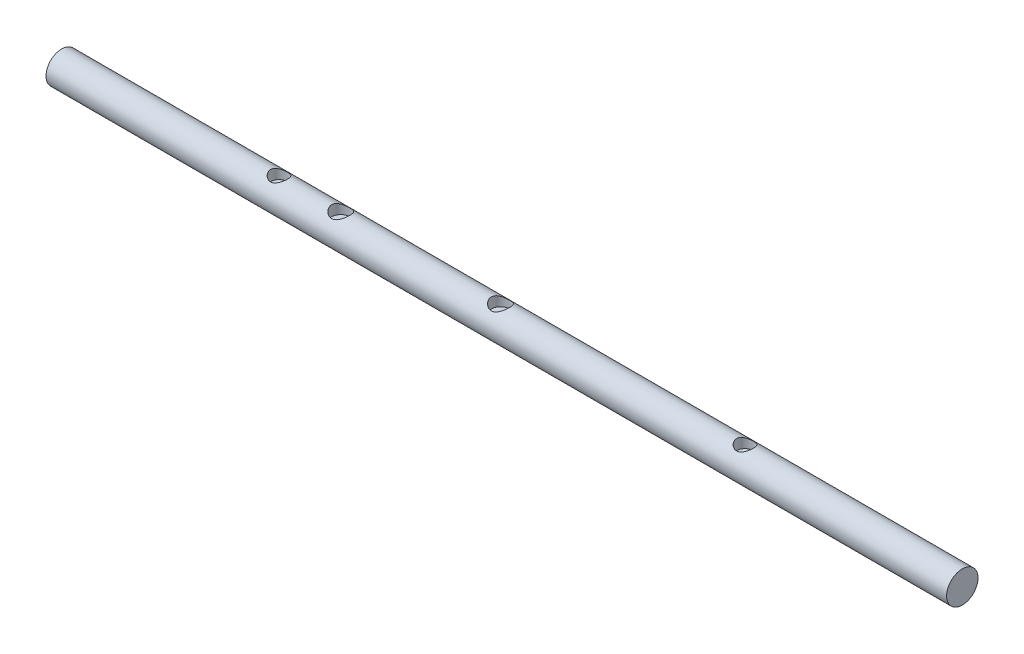
ISO-10303-21;
HEADER;
FILE_DESCRIPTION(('STEP AP214'),'2;1');
FILE_NAME('part.step','',(''),(''),'','','');
FILE_SCHEMA(('AUTOMOTIVE_DESIGN { 1 0 10303 214 1 1 1 1 }'));
ENDSEC;
DATA;
#1=APPLICATION_CONTEXT('core data for automotive mechanical design processes');
#2=APPLICATION_PROTOCOL_DEFINITION('international standard','automotive_design',2000,#1);
#3=PRODUCT_CONTEXT('',#1,'mechanical');
#4=PRODUCT('Part','Part','',(#3));
#5=PRODUCT_RELATED_PRODUCT_CATEGORY('part','',(#4));
#6=PRODUCT_DEFINITION_FORMATION('','',#4);
#7=PRODUCT_DEFINITION_CONTEXT('part definition',#1,'design');
#8=PRODUCT_DEFINITION('design','',#6,#7);
#9=PRODUCT_DEFINITION_SHAPE('','',#8);
#10=(LENGTH_UNIT() NAMED_UNIT(*) SI_UNIT(.MILLI.,.METRE.));
#11=(NAMED_UNIT(*) PLANE_ANGLE_UNIT() SI_UNIT($,.RADIAN.));
#12=(NAMED_UNIT(*) SI_UNIT($,.STERADIAN.) SOLID_ANGLE_UNIT());
#13=UNCERTAINTY_MEASURE_WITH_UNIT(LENGTH_MEASURE(1.E-05),#10,'distance_accuracy_value','');
#14=(GEOMETRIC_REPRESENTATION_CONTEXT(3) GLOBAL_UNCERTAINTY_ASSIGNED_CONTEXT((#13)) GLOBAL_UNIT_ASSIGNED_CONTEXT((#10,
#11,#12)) REPRESENTATION_CONTEXT('',''));
#15=CARTESIAN_POINT('',(0.,0.,0.));
#16=DIRECTION('',(0.,0.,1.));
#17=DIRECTION('',(1.,0.,0.));
#18=AXIS2_PLACEMENT_3D('',#15,#16,#17);
#19=CARTESIAN_POINT('',(-158.807280426727,1.90243902439024,0.));
#20=DIRECTION('',(-1.,0.,0.));
#21=DIRECTION('',(0.,0.,1.));
#22=AXIS2_PLACEMENT_3D('',#19,#20,#21);
#23=PLANE('',#22);
#24=CARTESIAN_POINT('',(-158.807280426727,1.90243902439024,0.));
#25=DIRECTION('',(-1.,0.,0.));
#26=DIRECTION('',(0.,0.,1.));
#27=AXIS2_PLACEMENT_3D('',#24,#25,#26);
#28=CIRCLE('',#27,3.);
#29=CARTESIAN_POINT('',(-158.807280426727,1.90243902439024,3.));
#30=VERTEX_POINT('',#29);
#31=EDGE_CURVE('E86',#30,#30,#28,.T.);
#32=ORIENTED_EDGE('',*,*,#31,.T.);
#33=EDGE_LOOP('',(#32));
#34=FACE_BOUND('',#33,.T.);
#35=ADVANCED_FACE('F30',(#34),#23,.T.);
#36=CARTESIAN_POINT('',(-158.807280426727,1.90243902439024,0.));
#37=DIRECTION('',(-1.,0.,0.));
#38=DIRECTION('',(0.,0.,1.));
#39=AXIS2_PLACEMENT_3D('',#36,#37,#38);
#40=CYLINDRICAL_SURFACE('',#39,3.);
#41=CARTESIAN_POINT('',(-105.507280426727,4.33913761059249,1.75));
#42=CARTESIAN_POINT('',(-105.418641531446,4.33913723530836,1.75000045184634));
#43=CARTESIAN_POINT('',(-105.330004321061,4.34404690899767,1.74322391194511));
#44=CARTESIAN_POINT('',(-105.155671235548,4.36284293080755,1.71658538535328));
#45=CARTESIAN_POINT('',(-105.069978488247,4.37673853179508,1.69670991020086));
#46=CARTESIAN_POINT('',(-104.904409163897,4.41130721542861,1.64515183199159));
#47=CARTESIAN_POINT('',(-104.824497468406,4.43193426987562,1.61354922075016));
#48=CARTESIAN_POINT('',(-104.671150372913,4.47755901924247,1.53968773008133));
#49=CARTESIAN_POINT('',(-104.597717056532,4.50255811267368,1.49742543895691));
#50=CARTESIAN_POINT('',(-104.450151281322,4.55758614424946,1.39777992638195));
#51=CARTESIAN_POINT('',(-104.376907376253,4.58786299897202,1.33921745197901));
#52=CARTESIAN_POINT('',(-104.240551260762,4.6480461718147,1.21105723337492));
#53=CARTESIAN_POINT('',(-104.177446060368,4.67795222048281,1.14145191954028));
#54=CARTESIAN_POINT('',(-104.056915186871,4.73758395133871,0.984713035802144));
#55=CARTESIAN_POINT('',(-104.000691674238,4.76699147363729,0.896522073845247));
#56=CARTESIAN_POINT('',(-103.904297675824,4.81884107580118,0.709891668525838));
#57=CARTESIAN_POINT('',(-103.864113326747,4.84128916721883,0.611461168794444));
#58=CARTESIAN_POINT('',(-103.804840852669,4.8748559224903,0.416649273147372));
#59=CARTESIAN_POINT('',(-103.784161105008,4.88682210638916,0.320901861024324));
#60=CARTESIAN_POINT('',(-103.759128724244,4.90134287656261,0.126621897572967));
#61=CARTESIAN_POINT('',(-103.754761826026,4.9039056857815,0.0280918555915908));
#62=CARTESIAN_POINT('',(-103.762136805078,4.89960876840552,-0.156495068538422));
#63=CARTESIAN_POINT('',(-103.772047715387,4.89381991594171,-0.242658294595014));
#64=CARTESIAN_POINT('',(-103.804253976583,4.87525347351467,-0.411844523266137));
#65=CARTESIAN_POINT('',(-103.826550241395,4.86247536780944,-0.494867293660781));
#66=CARTESIAN_POINT('',(-103.88276251452,4.83092244262679,-0.656364893028942));
#67=CARTESIAN_POINT('',(-103.916766421572,4.8121023353425,-0.734799910253173));
#68=CARTESIAN_POINT('',(-103.995158036549,4.77000278211207,-0.884967789919838));
#69=CARTESIAN_POINT('',(-104.039548657745,4.74672208538971,-0.956698764094662));
#70=CARTESIAN_POINT('',(-104.143269177095,4.69453276609062,-1.10031993041439));
#71=CARTESIAN_POINT('',(-104.203733756588,4.66528461671352,-1.17126676062861));
#72=CARTESIAN_POINT('',(-104.334945977294,4.6058524212521,-1.30259918374289));
#73=CARTESIAN_POINT('',(-104.405706712092,4.57566722256191,-1.3629711098475));
#74=CARTESIAN_POINT('',(-104.564457173089,4.51404786463935,-1.47789838153368));
#75=CARTESIAN_POINT('',(-104.653478797751,4.48282209775406,-1.53115297544719));
#76=CARTESIAN_POINT('',(-104.84118890961,4.42696289837199,-1.62161168095688));
#77=CARTESIAN_POINT('',(-104.939859509191,4.40231757187426,-1.65884482652416));
#78=CARTESIAN_POINT('',(-105.120046417644,4.36852484856211,-1.7085372011066));
#79=CARTESIAN_POINT('',(-105.200092002106,4.35708951233583,-1.72477506877111));
#80=CARTESIAN_POINT('',(-105.362362901543,4.3421117518518,-1.74590213357921));
#81=CARTESIAN_POINT('',(-105.444585859386,4.33856111914416,-1.75080313330495));
#82=CARTESIAN_POINT('',(-105.608901630009,4.33986956308162,-1.74898039241038));
#83=CARTESIAN_POINT('',(-105.690994260813,4.34473615815191,-1.74224625907734));
#84=CARTESIAN_POINT('',(-105.852642567158,4.36217426084861,-1.71753388251395));
#85=CARTESIAN_POINT('',(-105.932196277537,4.37475159148775,-1.69954714130061));
#86=CARTESIAN_POINT('',(-106.087467424403,4.40609181115408,-1.65302928692431));
#87=CARTESIAN_POINT('',(-106.163152919132,4.42489882088418,-1.62442278126807));
#88=CARTESIAN_POINT('',(-106.30892937046,4.46666466493333,-1.55765692699782));
#89=CARTESIAN_POINT('',(-106.379018101748,4.48962513896661,-1.51949380330519));
#90=CARTESIAN_POINT('',(-106.524399283031,4.54188291937461,-1.42709875316828));
#91=CARTESIAN_POINT('',(-106.598506816652,4.57159036344945,-1.37123101284258));
#92=CARTESIAN_POINT('',(-106.737021942423,4.63114763415145,-1.24852240970034));
#93=CARTESIAN_POINT('',(-106.801420853425,4.66099756387218,-1.18167183667127));
#94=CARTESIAN_POINT('',(-106.925904132265,4.72142973988237,-1.02989256043404));
#95=CARTESIAN_POINT('',(-106.984700112567,4.75172041345184,-0.943778122538591));
#96=CARTESIAN_POINT('',(-107.086662226916,4.80589918405285,-0.760910913608859));
#97=CARTESIAN_POINT('',(-107.129840061324,4.82979207049812,-0.664166177419411));
#98=CARTESIAN_POINT('',(-107.195643319311,4.86679224526954,-0.47067402489659));
#99=CARTESIAN_POINT('',(-107.219615880414,4.88059889039796,-0.374522814239406));
#100=CARTESIAN_POINT('',(-107.250945166461,4.89871949654074,-0.178706533702763));
#101=CARTESIAN_POINT('',(-107.258318202898,4.90304277625949,-0.0790450111451294));
#102=CARTESIAN_POINT('',(-107.256146609079,4.90177905155775,0.107655929988305));
#103=CARTESIAN_POINT('',(-107.24857832381,4.89734971619842,0.194734538061884));
#104=CARTESIAN_POINT('',(-107.220750573413,4.88125599933134,0.366137785941607));
#105=CARTESIAN_POINT('',(-107.200490632246,4.86959134644201,0.450462322323413));
#106=CARTESIAN_POINT('',(-107.148350893452,4.84015143934269,0.613761582363572));
#107=CARTESIAN_POINT('',(-107.116532520951,4.82240851484728,0.69276201643977));
#108=CARTESIAN_POINT('',(-107.042424828591,4.78223067777332,0.844368647802306));
#109=CARTESIAN_POINT('',(-107.000132883332,4.75979458898304,0.916973235651941));
#110=CARTESIAN_POINT('',(-106.901045560607,4.70922864147308,1.06230015031832));
#111=CARTESIAN_POINT('',(-106.843167477503,4.68074408218634,1.13415977100245));
#112=CARTESIAN_POINT('',(-106.717166437013,4.62240282910893,1.26772272997665));
#113=CARTESIAN_POINT('',(-106.649031421269,4.5925445494081,1.32941393272294));
#114=CARTESIAN_POINT('',(-106.495269536322,4.53076684457972,1.44805208639207));
#115=CARTESIAN_POINT('',(-106.408533785546,4.49900120197476,1.50365362198231));
#116=CARTESIAN_POINT('',(-106.225145452224,4.44120003340224,1.59932168084082));
#117=CARTESIAN_POINT('',(-106.128505241804,4.4151574833474,1.63940729371889));
#118=CARTESIAN_POINT('',(-105.944900822951,4.37678998306395,1.69663483894556));
#119=CARTESIAN_POINT('',(-105.859138371527,4.36287463392268,1.71653991344376));
#120=CARTESIAN_POINT('',(-105.684674094747,4.34405473809928,1.74321337060432));
#121=CARTESIAN_POINT('',(-105.595976417204,4.33913798611835,1.74999954786261));
#122=CARTESIAN_POINT('',(-105.507280426727,4.33913761059249,1.75));
#123=B_SPLINE_CURVE_WITH_KNOTS('',3,(#41,#42,#43,#44,#45,#46,#47,#48,#49,#50,#51,#52,#53,#54,
#55,#56,#57,#58,#59,#60,#61,#62,#63,#64,#65,#66,#67,#68,#69,#70,#71,#72,#73,#74,#75,#76,#77,#78,
#79,#80,#81,#82,#83,#84,#85,#86,#87,#88,#89,#90,#91,#92,#93,#94,#95,#96,#97,#98,#99,#100,#101,
#102,#103,#104,#105,#106,#107,#108,#109,#110,#111,#112,#113,#114,#115,#116,#117,#118,#119,#120,
#121,#122),.UNSPECIFIED.,.T.,.F.,(4,2,2,2,2,2,2,2,2,2,2,2,2,2,2,2,2,2,2,2,2,2,2,2,2,2,2,2,2,2,2,
2,2,2,2,2,2,2,2,2,4),(0.,0.2655452187637,0.53136430747416,0.795402587763056,1.05952548262139,
1.35398659107802,1.64865042554403,1.972831424877,2.29673161156481,2.59104789961809,
2.88510675625998,3.14464340280144,3.40419920332161,3.66574779852172,3.92736984114419,
4.21928633023892,4.51157734664538,4.83494305243832,5.15772026336275,5.40406403188871,
5.65015122128838,5.89645833389884,6.14295168285399,6.39122950133274,6.63960555026166,
6.93078691809868,7.22222712635784,7.54626723053989,7.87006407425507,8.16844648867913,
8.46653556995419,8.72782114336878,8.98911651764956,9.24904312841218,9.50903496080324,
9.79757898950312,10.0864649272872,10.4083273312523,10.7297924718895,10.9958699008298,
11.2615861659037),.UNSPECIFIED.);
#124=CARTESIAN_POINT('',(-105.507280426727,4.33913761059249,1.75));
#125=VERTEX_POINT('',#124);
#126=EDGE_CURVE('E10',#125,#125,#123,.T.);
#127=ORIENTED_EDGE('',*,*,#126,.F.);
#128=EDGE_LOOP('',(#127));
#129=FACE_BOUND('',#128,.T.);
#130=CARTESIAN_POINT('',(-75.0072804267274,4.33913761059249,1.75));
#131=CARTESIAN_POINT('',(-74.918641531446,4.33913723530836,1.75000045184634));
#132=CARTESIAN_POINT('',(-74.8300043210609,4.34404690899767,1.74322391194511));
#133=CARTESIAN_POINT('',(-74.6556712355481,4.36284293080755,1.71658538535328));
#134=CARTESIAN_POINT('',(-74.569978488247,4.37673853179508,1.69670991020086));
#135=CARTESIAN_POINT('',(-74.4044091638969,4.41130721542861,1.64515183199159));
#136=CARTESIAN_POINT('',(-74.3244974684062,4.43193426987562,1.61354922075016));
#137=CARTESIAN_POINT('',(-74.1711503729129,4.47755901924247,1.53968773008133));
#138=CARTESIAN_POINT('',(-74.0977170565318,4.50255811267368,1.49742543895691));
#139=CARTESIAN_POINT('',(-73.9501512813216,4.55758614424946,1.39777992638195));
#140=CARTESIAN_POINT('',(-73.8769073762534,4.58786299897202,1.33921745197901));
#141=CARTESIAN_POINT('',(-73.7405512607623,4.6480461718147,1.21105723337492));
#142=CARTESIAN_POINT('',(-73.6774460603676,4.67795222048281,1.14145191954028));
#143=CARTESIAN_POINT('',(-73.5569151868713,4.73758395133871,0.984713035802144));
#144=CARTESIAN_POINT('',(-73.5006916742382,4.76699147363729,0.896522073845247));
#145=CARTESIAN_POINT('',(-73.4042976758237,4.81884107580118,0.709891668525838));
#146=CARTESIAN_POINT('',(-73.3641133267474,4.84128916721883,0.611461168794444));
#147=CARTESIAN_POINT('',(-73.3048408526686,4.8748559224903,0.416649273147372));
#148=CARTESIAN_POINT('',(-73.2841611050082,4.88682210638916,0.320901861024323));
#149=CARTESIAN_POINT('',(-73.2591287242444,4.90134287656261,0.126621897572966));
#150=CARTESIAN_POINT('',(-73.254761826026,4.9039056857815,0.0280918555915903));
#151=CARTESIAN_POINT('',(-73.2621368050776,4.89960876840552,-0.156495068538422));
#152=CARTESIAN_POINT('',(-73.2720477153867,4.89381991594171,-0.242658294595014));
#153=CARTESIAN_POINT('',(-73.3042539765826,4.87525347351467,-0.411844523266137));
#154=CARTESIAN_POINT('',(-73.3265502413954,4.86247536780944,-0.494867293660781));
#155=CARTESIAN_POINT('',(-73.3827625145198,4.83092244262679,-0.656364893028942));
#156=CARTESIAN_POINT('',(-73.4167664215715,4.8121023353425,-0.734799910253173));
#157=CARTESIAN_POINT('',(-73.4951580365486,4.77000278211207,-0.884967789919838));
#158=CARTESIAN_POINT('',(-73.5395486577454,4.74672208538971,-0.956698764094662));
#159=CARTESIAN_POINT('',(-73.6432691770949,4.69453276609062,-1.10031993041439));
#160=CARTESIAN_POINT('',(-73.7037337565881,4.66528461671352,-1.17126676062861));
#161=CARTESIAN_POINT('',(-73.8349459772945,4.6058524212521,-1.30259918374289));
#162=CARTESIAN_POINT('',(-73.9057067120921,4.57566722256191,-1.3629711098475));
#163=CARTESIAN_POINT('',(-74.0644571730887,4.51404786463935,-1.47789838153368));
#164=CARTESIAN_POINT('',(-74.153478797751,4.48282209775406,-1.53115297544719));
#165=CARTESIAN_POINT('',(-74.3411889096099,4.42696289837199,-1.62161168095688));
#166=CARTESIAN_POINT('',(-74.4398595091906,4.40231757187426,-1.65884482652416));
#167=CARTESIAN_POINT('',(-74.6200464176443,4.36852484856211,-1.7085372011066));
#168=CARTESIAN_POINT('',(-74.7000920021063,4.35708951233583,-1.72477506877111));
#169=CARTESIAN_POINT('',(-74.8623629015428,4.3421117518518,-1.74590213357921));
#170=CARTESIAN_POINT('',(-74.9445858593855,4.33856111914416,-1.75080313330495));
#171=CARTESIAN_POINT('',(-75.108901630009,4.33986956308162,-1.74898039241038));
#172=CARTESIAN_POINT('',(-75.1909942608133,4.34473615815191,-1.74224625907734));
#173=CARTESIAN_POINT('',(-75.3526425671579,4.36217426084861,-1.71753388251395));
#174=CARTESIAN_POINT('',(-75.4321962775368,4.37475159148775,-1.69954714130061));
#175=CARTESIAN_POINT('',(-75.5874674244025,4.40609181115408,-1.65302928692431));
#176=CARTESIAN_POINT('',(-75.6631529191318,4.42489882088418,-1.62442278126807));
#177=CARTESIAN_POINT('',(-75.8089293704604,4.46666466493333,-1.55765692699782));
#178=CARTESIAN_POINT('',(-75.8790181017482,4.48962513896661,-1.51949380330519));
#179=CARTESIAN_POINT('',(-76.0243992830305,4.54188291937461,-1.42709875316828));
#180=CARTESIAN_POINT('',(-76.0985068166523,4.57159036344945,-1.37123101284258));
#181=CARTESIAN_POINT('',(-76.2370219424235,4.63114763415145,-1.24852240970034));
#182=CARTESIAN_POINT('',(-76.3014208534254,4.66099756387218,-1.18167183667127));
#183=CARTESIAN_POINT('',(-76.4259041322653,4.72142973988237,-1.02989256043403));
#184=CARTESIAN_POINT('',(-76.4847001125672,4.75172041345184,-0.943778122538587));
#185=CARTESIAN_POINT('',(-76.5866622269155,4.80589918405285,-0.760910913608855));
#186=CARTESIAN_POINT('',(-76.6298400613238,4.82979207049812,-0.664166177419409));
#187=CARTESIAN_POINT('',(-76.695643319311,4.86679224526954,-0.47067402489659));
#188=CARTESIAN_POINT('',(-76.7196158804139,4.88059889039796,-0.374522814239406));
#189=CARTESIAN_POINT('',(-76.7509451664609,4.89871949654074,-0.178706533702763));
#190=CARTESIAN_POINT('',(-76.7583182028977,4.90304277625949,-0.0790450111451294));
#191=CARTESIAN_POINT('',(-76.7561466090788,4.90177905155775,0.107655929988305));
#192=CARTESIAN_POINT('',(-76.7485783238101,4.89734971619842,0.194734538061884));
#193=CARTESIAN_POINT('',(-76.7207505734127,4.88125599933134,0.366137785941607));
#194=CARTESIAN_POINT('',(-76.7004906322463,4.86959134644201,0.450462322323413));
#195=CARTESIAN_POINT('',(-76.6483508934525,4.84015143934269,0.613761582363572));
#196=CARTESIAN_POINT('',(-76.6165325209513,4.82240851484728,0.69276201643977));
#197=CARTESIAN_POINT('',(-76.5424248285914,4.78223067777332,0.844368647802306));
#198=CARTESIAN_POINT('',(-76.5001328833318,4.75979458898304,0.916973235651941));
#199=CARTESIAN_POINT('',(-76.4010455606065,4.70922864147308,1.06230015031832));
#200=CARTESIAN_POINT('',(-76.3431674775032,4.68074408218634,1.13415977100245));
#201=CARTESIAN_POINT('',(-76.2171664370126,4.62240282910893,1.26772272997665));
#202=CARTESIAN_POINT('',(-76.1490314212692,4.5925445494081,1.32941393272294));
#203=CARTESIAN_POINT('',(-75.9952695363219,4.53076684457972,1.44805208639207));
#204=CARTESIAN_POINT('',(-75.9085337855463,4.49900120197476,1.50365362198231));
#205=CARTESIAN_POINT('',(-75.7251454522238,4.44120003340224,1.59932168084082));
#206=CARTESIAN_POINT('',(-75.6285052418039,4.4151574833474,1.63940729371889));
#207=CARTESIAN_POINT('',(-75.4449008229507,4.37678998306395,1.69663483894556));
#208=CARTESIAN_POINT('',(-75.3591383715268,4.36287463392268,1.71653991344376));
#209=CARTESIAN_POINT('',(-75.1846740947475,4.34405473809928,1.74321337060432));
#210=CARTESIAN_POINT('',(-75.0959764172036,4.33913798611835,1.74999954786261));
#211=CARTESIAN_POINT('',(-75.0072804267274,4.33913761059249,1.75));
#212=B_SPLINE_CURVE_WITH_KNOTS('',3,(#130,#131,#132,#133,#134,#135,#136,#137,#138,#139,#140,
#141,#142,#143,#144,#145,#146,#147,#148,#149,#150,#151,#152,#153,#154,#155,#156,#157,#158,#159,
#160,#161,#162,#163,#164,#165,#166,#167,#168,#169,#170,#171,#172,#173,#174,#175,#176,#177,#178,
#179,#180,#181,#182,#183,#184,#185,#186,#187,#188,#189,#190,#191,#192,#193,#194,#195,#196,#197,
#198,#199,#200,#201,#202,#203,#204,#205,#206,#207,#208,#209,#210,#211),.UNSPECIFIED.,.T.,.F.,(4,
2,2,2,2,2,2,2,2,2,2,2,2,2,2,2,2,2,2,2,2,2,2,2,2,2,2,2,2,2,2,2,2,2,2,2,2,2,2,2,4),(0.,
0.2655452187637,0.53136430747416,0.795402587763056,1.05952548262139,1.35398659107802,
1.64865042554403,1.972831424877,2.29673161156481,2.59104789961809,2.88510675625998,
3.14464340280144,3.40419920332161,3.66574779852172,3.92736984114419,4.21928633023892,
4.51157734664538,4.83494305243832,5.15772026336275,5.40406403188871,5.65015122128838,
5.89645833389884,6.14295168285399,6.39122950133274,6.63960555026166,6.93078691809868,
7.22222712635784,7.5462672305399,7.87006407425507,8.16844648867913,8.46653556995419,
8.72782114336878,8.98911651764956,9.24904312841218,9.50903496080324,9.79757898950312,
10.0864649272872,10.4083273312523,10.7297924718895,10.9958699008298,11.2615861659037),.UNSPECIFIED.);
#213=CARTESIAN_POINT('',(-75.0072804267274,4.33913761059249,1.75));
#214=VERTEX_POINT('',#213);
#215=EDGE_CURVE('E39',#214,#214,#212,.T.);
#216=ORIENTED_EDGE('',*,*,#215,.F.);
#217=EDGE_LOOP('',(#216));
#218=FACE_BOUND('',#217,.T.);
#219=CARTESIAN_POINT('',(-28.3072804267275,4.44015453248015,1.59999999999999));
#220=CARTESIAN_POINT('',(-28.2248058956568,4.44016295845389,1.59999372902863));
#221=CARTESIAN_POINT('',(-28.1422478615321,4.44423791706064,1.59357932983776));
#222=CARTESIAN_POINT('',(-27.9797387920065,4.45991745247716,1.56828258203231));
#223=CARTESIAN_POINT('',(-27.8997927785371,4.47153572933059,1.54937754703875));
#224=CARTESIAN_POINT('',(-27.7451760281645,4.50055710832812,1.50019479249202));
#225=CARTESIAN_POINT('',(-27.6704771601463,4.5179259624974,1.46998426801954));
#226=CARTESIAN_POINT('',(-27.5272319656127,4.55643676833023,1.39925451330501));
#227=CARTESIAN_POINT('',(-27.4586866390299,4.57757933154853,1.3587336117439));
#228=CARTESIAN_POINT('',(-27.3225506848167,4.62369019457102,1.2640475037326));
#229=CARTESIAN_POINT('',(-27.2556638274798,4.64883120046568,1.2089541600422));
#230=CARTESIAN_POINT('',(-27.1315205372775,4.69871822802368,1.08860845760442));
#231=CARTESIAN_POINT('',(-27.0742695161589,4.72346402071047,1.02335042944415));
#232=CARTESIAN_POINT('',(-26.9665603495707,4.77211499119682,0.878216095721792));
#233=CARTESIAN_POINT('',(-26.9170013461809,4.79579776109383,0.797590815734638));
#234=CARTESIAN_POINT('',(-26.8324763796826,4.83734772609704,0.627645549869456));
#235=CARTESIAN_POINT('',(-26.797499956968,4.85521908750393,0.538331852815014));
#236=CARTESIAN_POINT('',(-26.7460337198808,4.88187645257184,0.36102902920185));
#237=CARTESIAN_POINT('',(-26.7282999871263,4.89126951665842,0.273494411235118));
#238=CARTESIAN_POINT('',(-26.7076915057428,4.90220629688281,0.0962309461098355));
#239=CARTESIAN_POINT('',(-26.7048062995127,4.90375553729898,0.00650368795728988));
#240=CARTESIAN_POINT('',(-26.7135767189436,4.89908476291532,-0.163099999904368));
#241=CARTESIAN_POINT('',(-26.7238263584006,4.89361590064874,-0.243075222391697));
#242=CARTESIAN_POINT('',(-26.7560107552787,4.87670370136586,-0.399969935826735));
#243=CARTESIAN_POINT('',(-26.7779464006563,4.86525991034831,-0.476889194090903));
#244=CARTESIAN_POINT('',(-26.8329334908085,4.83725319711169,-0.626696643763502));
#245=CARTESIAN_POINT('',(-26.8661150876736,4.82063052926011,-0.699525429708876));
#246=CARTESIAN_POINT('',(-26.9424254709554,4.78370869241812,-0.838736612142137));
#247=CARTESIAN_POINT('',(-26.9855575951738,4.7634082902614,-0.905116834884366));
#248=CARTESIAN_POINT('',(-27.0856471366901,4.71849719811056,-1.03689401245649));
#249=CARTESIAN_POINT('',(-27.1435737534776,4.69365784924578,-1.10147714320615));
#250=CARTESIAN_POINT('',(-27.2690535855431,4.64371612903278,-1.22048082664393));
#251=CARTESIAN_POINT('',(-27.3366158500906,4.61861353122274,-1.27489171384594));
#252=CARTESIAN_POINT('',(-27.4859332107454,4.56876189687086,-1.37628547852476));
#253=CARTESIAN_POINT('',(-27.5683887636658,4.54419854338959,-1.42233793711388));
#254=CARTESIAN_POINT('',(-27.7414376089471,4.50113101049669,-1.49959087550645));
#255=CARTESIAN_POINT('',(-27.8320215326716,4.48261996675845,-1.53080819917997));
#256=CARTESIAN_POINT('',(-28.01112615462,4.45597206549175,-1.57482918610284));
#257=CARTESIAN_POINT('',(-28.0992179837435,4.44711537487983,-1.58892130462436));
#258=CARTESIAN_POINT('',(-28.2769247659103,4.43879043729457,-1.60218459192318));
#259=CARTESIAN_POINT('',(-28.3665381576849,4.43931308659266,-1.60137022914036));
#260=CARTESIAN_POINT('',(-28.5320023585753,4.448921956201,-1.58602515311979));
#261=CARTESIAN_POINT('',(-28.6081022669968,4.45686331090216,-1.57332778120754));
#262=CARTESIAN_POINT('',(-28.7569028009161,4.47862547326262,-1.53743313580969));
#263=CARTESIAN_POINT('',(-28.82960208135,4.49244858589231,-1.51423174573271));
#264=CARTESIAN_POINT('',(-28.9732535180807,4.52510959303932,-1.45695779214084));
#265=CARTESIAN_POINT('',(-29.0439857308696,4.5441424564798,-1.42244930349409));
#266=CARTESIAN_POINT('',(-29.1790772420912,4.58495187845427,-1.34390586859304));
#267=CARTESIAN_POINT('',(-29.2434332739332,4.6067298304799,-1.29986607575593));
#268=CARTESIAN_POINT('',(-29.3738697575652,4.65442038185212,-1.1959612137011));
#269=CARTESIAN_POINT('',(-29.4388099447665,4.6804697672942,-1.13472097029283));
#270=CARTESIAN_POINT('',(-29.5579152024024,4.73107455734323,-1.00193372332186));
#271=CARTESIAN_POINT('',(-29.6120749254984,4.75562921636324,-0.930381635050939));
#272=CARTESIAN_POINT('',(-29.7101222022494,4.80175184881381,-0.775115096617049));
#273=CARTESIAN_POINT('',(-29.7534893118938,4.82315328867068,-0.69101877168908));
#274=CARTESIAN_POINT('',(-29.8250045069962,4.85921560554733,-0.515257075494538));
#275=CARTESIAN_POINT('',(-29.8531676466029,4.8738831479471,-0.423599295249479));
#276=CARTESIAN_POINT('',(-29.8907621727549,4.89362406805444,-0.245085247888811));
#277=CARTESIAN_POINT('',(-29.9017702307446,4.89950262399579,-0.158650200440573));
#278=CARTESIAN_POINT('',(-29.9095659301253,4.90365620925563,0.0150269330897094));
#279=CARTESIAN_POINT('',(-29.9063601115052,4.90193473544785,0.102268629586524));
#280=CARTESIAN_POINT('',(-29.886763496255,4.89153744339052,0.267577989158695));
#281=CARTESIAN_POINT('',(-29.8714634695803,4.88343714706527,0.345815720280644));
#282=CARTESIAN_POINT('',(-29.8297178558259,4.86174610752327,0.498443755728398));
#283=CARTESIAN_POINT('',(-29.8032708576901,4.84815466921122,0.572833571621198));
#284=CARTESIAN_POINT('',(-29.7390123093529,4.8160370712502,0.718851778895749));
#285=CARTESIAN_POINT('',(-29.7008098112209,4.79734415110553,0.79027025183419));
#286=CARTESIAN_POINT('',(-29.6146052225089,4.75684805725578,0.92594264372896));
#287=CARTESIAN_POINT('',(-29.5665989083281,4.73504354426309,0.990193456262651));
#288=CARTESIAN_POINT('',(-29.4560540303116,4.68756354490345,1.11721494450397));
#289=CARTESIAN_POINT('',(-29.3924964739033,4.66172639793873,1.1790401452611));
#290=CARTESIAN_POINT('',(-29.2557892040443,4.61087847917547,1.29157988795467));
#291=CARTESIAN_POINT('',(-29.1826290371592,4.58586864568734,1.34228215838382));
#292=CARTESIAN_POINT('',(-29.0238233172775,4.53822953282082,1.43366897954619));
#293=CARTESIAN_POINT('',(-28.9377171771478,4.51580141245792,1.47366570008067));
#294=CARTESIAN_POINT('',(-28.7584507056375,4.47847671521322,1.53799938953918));
#295=CARTESIAN_POINT('',(-28.6653145798702,4.46355553905193,1.56238757803549));
#296=CARTESIAN_POINT('',(-28.5270324143171,4.44928236663846,1.58544926946727));
#297=CARTESIAN_POINT('',(-28.4833395291716,4.44587641768009,1.59089425785166));
#298=CARTESIAN_POINT('',(-28.3955325541298,4.4413102036175,1.59817136921367));
#299=CARTESIAN_POINT('',(-28.3514184484241,4.44015002313882,1.60000335604538));
#300=CARTESIAN_POINT('',(-28.3072804267275,4.44015453248015,1.59999999999999));
#301=B_SPLINE_CURVE_WITH_KNOTS('',3,(#219,#220,#221,#222,#223,#224,#225,#226,#227,#228,#229,
#230,#231,#232,#233,#234,#235,#236,#237,#238,#239,#240,#241,#242,#243,#244,#245,#246,#247,#248,
#249,#250,#251,#252,#253,#254,#255,#256,#257,#258,#259,#260,#261,#262,#263,#264,#265,#266,#267,
#268,#269,#270,#271,#272,#273,#274,#275,#276,#277,#278,#279,#280,#281,#282,#283,#284,#285,#286,
#287,#288,#289,#290,#291,#292,#293,#294,#295,#296,#297,#298,#299,#300),.UNSPECIFIED.,.T.,.F.,(4,
2,2,2,2,2,2,2,2,2,2,2,2,2,2,2,2,2,2,2,2,2,2,2,2,2,2,2,2,2,2,2,2,2,2,2,2,2,2,2,4),(0.,
0.247236947174776,0.494924182632615,0.741162065387768,0.987439888926945,1.25701617256929,
1.52674335596951,1.81786745875612,2.10878238704998,2.37667542174061,2.6443797574219,
2.88568250515368,3.1270035907937,3.37121873440956,3.61551591689503,3.8851140185053,
4.15496699977605,4.44620613475031,4.73711380091715,5.00441947808846,5.27146571838894,
5.50309713228811,5.73481940269523,5.97680341191483,6.21891075815243,6.4966512867081,
6.77452923901572,7.06395553861627,7.35309473588108,7.61364749838929,7.87408038963901,
8.11338489734168,8.35271970686206,8.60107981850479,8.84954715321502,9.12542892067865,
9.40161354419157,9.69269476285072,9.98281583025832,10.1151250220935,10.2474391995363),.UNSPECIFIED.);
#302=CARTESIAN_POINT('',(-28.3072804267275,4.44015453248015,1.59999999999999));
#303=VERTEX_POINT('',#302);
#304=EDGE_CURVE('E43',#303,#303,#301,.T.);
#305=ORIENTED_EDGE('',*,*,#304,.F.);
#306=EDGE_LOOP('',(#305));
#307=FACE_BOUND('',#306,.T.);
#308=CARTESIAN_POINT('',(-117.307280426727,4.44015453248015,1.59999999999999));
#309=CARTESIAN_POINT('',(-117.224805895657,4.44016295845389,1.59999372902863));
#310=CARTESIAN_POINT('',(-117.142247861532,4.44423791706064,1.59357932983776));
#311=CARTESIAN_POINT('',(-116.979738792006,4.45991745247716,1.56828258203231));
#312=CARTESIAN_POINT('',(-116.899792778537,4.47153572933059,1.54937754703875));
#313=CARTESIAN_POINT('',(-116.745176028164,4.50055710832812,1.50019479249202));
#314=CARTESIAN_POINT('',(-116.670477160146,4.5179259624974,1.46998426801954));
#315=CARTESIAN_POINT('',(-116.527231965613,4.55643676833023,1.39925451330502));
#316=CARTESIAN_POINT('',(-116.45868663903,4.57757933154853,1.3587336117439));
#317=CARTESIAN_POINT('',(-116.322550684817,4.62369019457102,1.2640475037326));
#318=CARTESIAN_POINT('',(-116.25566382748,4.64883120046567,1.20895416004221));
#319=CARTESIAN_POINT('',(-116.131520537277,4.69871822802368,1.08860845760442));
#320=CARTESIAN_POINT('',(-116.074269516159,4.72346402071047,1.02335042944415));
#321=CARTESIAN_POINT('',(-115.966560349571,4.77211499119682,0.878216095721782));
#322=CARTESIAN_POINT('',(-115.917001346181,4.79579776109383,0.797590815734632));
#323=CARTESIAN_POINT('',(-115.832476379683,4.83734772609704,0.627645549869451));
#324=CARTESIAN_POINT('',(-115.797499956968,4.85521908750393,0.538331852815007));
#325=CARTESIAN_POINT('',(-115.746033719881,4.88187645257184,0.361029029201841));
#326=CARTESIAN_POINT('',(-115.728299987126,4.89126951665842,0.27349441123511));
#327=CARTESIAN_POINT('',(-115.707691505743,4.90220629688281,0.0962309461098281));
#328=CARTESIAN_POINT('',(-115.704806299513,4.90375553729898,0.00650368795728305));
#329=CARTESIAN_POINT('',(-115.713576718944,4.89908476291532,-0.163099999904373));
#330=CARTESIAN_POINT('',(-115.723826358401,4.89361590064874,-0.243075222391701));
#331=CARTESIAN_POINT('',(-115.756010755279,4.87670370136586,-0.399969935826738));
#332=CARTESIAN_POINT('',(-115.777946400656,4.86525991034831,-0.476889194090907));
#333=CARTESIAN_POINT('',(-115.832933490808,4.83725319711169,-0.626696643763505));
#334=CARTESIAN_POINT('',(-115.866115087673,4.82063052926011,-0.699525429708878));
#335=CARTESIAN_POINT('',(-115.942425470955,4.78370869241812,-0.838736612142138));
#336=CARTESIAN_POINT('',(-115.985557595174,4.7634082902614,-0.905116834884369));
#337=CARTESIAN_POINT('',(-116.08564713669,4.71849719811055,-1.03689401245649));
#338=CARTESIAN_POINT('',(-116.143573753478,4.69365784924578,-1.10147714320616));
#339=CARTESIAN_POINT('',(-116.269053585543,4.64371612903278,-1.22048082664393));
#340=CARTESIAN_POINT('',(-116.336615850091,4.61861353122274,-1.27489171384594));
#341=CARTESIAN_POINT('',(-116.485933210745,4.56876189687086,-1.37628547852477));
#342=CARTESIAN_POINT('',(-116.568388763666,4.54419854338959,-1.42233793711388));
#343=CARTESIAN_POINT('',(-116.741437608947,4.50113101049669,-1.49959087550645));
#344=CARTESIAN_POINT('',(-116.832021532672,4.48261996675845,-1.53080819917998));
#345=CARTESIAN_POINT('',(-117.01112615462,4.45597206549174,-1.57482918610285));
#346=CARTESIAN_POINT('',(-117.099217983743,4.44711537487983,-1.58892130462436));
#347=CARTESIAN_POINT('',(-117.27692476591,4.43879043729457,-1.60218459192318));
#348=CARTESIAN_POINT('',(-117.366538157685,4.43931308659266,-1.60137022914036));
#349=CARTESIAN_POINT('',(-117.532002358575,4.448921956201,-1.58602515311979));
#350=CARTESIAN_POINT('',(-117.608102266997,4.45686331090216,-1.57332778120754));
#351=CARTESIAN_POINT('',(-117.756902800916,4.47862547326262,-1.53743313580969));
#352=CARTESIAN_POINT('',(-117.82960208135,4.49244858589231,-1.51423174573272));
#353=CARTESIAN_POINT('',(-117.973253518081,4.52510959303932,-1.45695779214085));
#354=CARTESIAN_POINT('',(-118.04398573087,4.5441424564798,-1.42244930349409));
#355=CARTESIAN_POINT('',(-118.179077242091,4.58495187845427,-1.34390586859304));
#356=CARTESIAN_POINT('',(-118.243433273933,4.6067298304799,-1.29986607575593));
#357=CARTESIAN_POINT('',(-118.373869757565,4.65442038185212,-1.19596121370109));
#358=CARTESIAN_POINT('',(-118.438809944766,4.6804697672942,-1.13472097029282));
#359=CARTESIAN_POINT('',(-118.557915202402,4.73107455734323,-1.00193372332186));
#360=CARTESIAN_POINT('',(-118.612074925498,4.75562921636324,-0.930381635050936));
#361=CARTESIAN_POINT('',(-118.710122202249,4.80175184881381,-0.775115096617049));
#362=CARTESIAN_POINT('',(-118.753489311894,4.82315328867068,-0.691018771689081));
#363=CARTESIAN_POINT('',(-118.825004506996,4.85921560554733,-0.515257075494539));
#364=CARTESIAN_POINT('',(-118.853167646603,4.8738831479471,-0.423599295249479));
#365=CARTESIAN_POINT('',(-118.890762172755,4.89362406805444,-0.245085247888809));
#366=CARTESIAN_POINT('',(-118.901770230745,4.89950262399579,-0.158650200440572));
#367=CARTESIAN_POINT('',(-118.909565930125,4.90365620925563,0.01502693308971));
#368=CARTESIAN_POINT('',(-118.906360111505,4.90193473544785,0.102268629586524));
#369=CARTESIAN_POINT('',(-118.886763496255,4.89153744339052,0.267577989158696));
#370=CARTESIAN_POINT('',(-118.87146346958,4.88343714706527,0.345815720280646));
#371=CARTESIAN_POINT('',(-118.829717855826,4.86174610752327,0.4984437557284));
#372=CARTESIAN_POINT('',(-118.80327085769,4.84815466921122,0.572833571621198));
#373=CARTESIAN_POINT('',(-118.739012309353,4.8160370712502,0.718851778895751));
#374=CARTESIAN_POINT('',(-118.700809811221,4.79734415110553,0.790270251834196));
#375=CARTESIAN_POINT('',(-118.614605222509,4.75684805725578,0.925942643728965));
#376=CARTESIAN_POINT('',(-118.566598908328,4.73504354426309,0.990193456262654));
#377=CARTESIAN_POINT('',(-118.456054030312,4.68756354490344,1.11721494450397));
#378=CARTESIAN_POINT('',(-118.392496473903,4.66172639793872,1.17904014526111));
#379=CARTESIAN_POINT('',(-118.255789204044,4.61087847917546,1.29157988795468));
#380=CARTESIAN_POINT('',(-118.182629037159,4.58586864568734,1.34228215838383));
#381=CARTESIAN_POINT('',(-118.023823317277,4.53822953282082,1.43366897954619));
#382=CARTESIAN_POINT('',(-117.937717177148,4.51580141245792,1.47366570008067));
#383=CARTESIAN_POINT('',(-117.758450705637,4.47847671521322,1.53799938953918));
#384=CARTESIAN_POINT('',(-117.66531457987,4.46355553905193,1.56238757803549));
#385=CARTESIAN_POINT('',(-117.527032414317,4.44928236663846,1.58544926946727));
#386=CARTESIAN_POINT('',(-117.483339529171,4.44587641768009,1.59089425785167));
#387=CARTESIAN_POINT('',(-117.39553255413,4.4413102036175,1.59817136921367));
#388=CARTESIAN_POINT('',(-117.351418448424,4.44015002313882,1.60000335604538));
#389=CARTESIAN_POINT('',(-117.307280426727,4.44015453248015,1.59999999999999));
#390=B_SPLINE_CURVE_WITH_KNOTS('',3,(#308,#309,#310,#311,#312,#313,#314,#315,#316,#317,#318,
#319,#320,#321,#322,#323,#324,#325,#326,#327,#328,#329,#330,#331,#332,#333,#334,#335,#336,#337,
#338,#339,#340,#341,#342,#343,#344,#345,#346,#347,#348,#349,#350,#351,#352,#353,#354,#355,#356,
#357,#358,#359,#360,#361,#362,#363,#364,#365,#366,#367,#368,#369,#370,#371,#372,#373,#374,#375,
#376,#377,#378,#379,#380,#381,#382,#383,#384,#385,#386,#387,#388,#389),.UNSPECIFIED.,.T.,.F.,(4,
2,2,2,2,2,2,2,2,2,2,2,2,2,2,2,2,2,2,2,2,2,2,2,2,2,2,2,2,2,2,2,2,2,2,2,2,2,2,2,4),(0.,
0.247236947174773,0.494924182632619,0.741162065387757,0.987439888926941,1.25701617256929,
1.52674335596952,1.81786745875613,2.10878238705,2.37667542174062,2.64437975742191,
2.88568250515368,3.12700359079371,3.37121873440957,3.61551591689504,3.88511401850532,
4.15496699977606,4.4462061347503,4.73711380091717,5.00441947808849,5.27146571838895,
5.50309713228811,5.73481940269522,5.97680341191483,6.21891075815244,6.49665128670811,
6.77452923901573,7.06395553861627,7.35309473588108,7.61364749838929,7.87408038963902,
8.11338489734169,8.35271970686207,8.6010798185048,8.84954715321503,9.12542892067869,
9.40161354419159,9.69269476285073,9.98281583025833,10.1151250220935,10.2474391995363),.UNSPECIFIED.);
#391=CARTESIAN_POINT('',(-117.307280426727,4.44015453248015,1.59999999999999));
#392=VERTEX_POINT('',#391);
#393=EDGE_CURVE('E47',#392,#392,#390,.T.);
#394=ORIENTED_EDGE('',*,*,#393,.F.);
#395=EDGE_LOOP('',(#394));
#396=FACE_BOUND('',#395,.T.);
#397=CARTESIAN_POINT('',(13.1927195732725,1.90243902439024,0.));
#398=DIRECTION('',(-1.,0.,0.));
#399=DIRECTION('',(0.,0.,1.));
#400=AXIS2_PLACEMENT_3D('',#397,#398,#399);
#401=CIRCLE('',#400,3.);
#402=CARTESIAN_POINT('',(13.1927195732725,1.90243902439024,3.));
#403=VERTEX_POINT('',#402);
#404=EDGE_CURVE('E89',#403,#403,#401,.T.);
#405=ORIENTED_EDGE('',*,*,#404,.T.);
#406=EDGE_LOOP('',(#405));
#407=FACE_BOUND('',#406,.T.);
#408=ORIENTED_EDGE('',*,*,#31,.F.);
#409=EDGE_LOOP('',(#408));
#410=FACE_BOUND('',#409,.T.);
#411=ADVANCED_FACE('F56',(#129,#218,#307,#396,#407,#410),#40,.T.);
#412=CARTESIAN_POINT('',(13.1927195732725,1.90243902439024,0.));
#413=DIRECTION('',(1.,0.,0.));
#414=DIRECTION('',(0.,0.,-1.));
#415=AXIS2_PLACEMENT_3D('',#412,#413,#414);
#416=PLANE('',#415);
#417=ORIENTED_EDGE('',*,*,#404,.F.);
#418=EDGE_LOOP('',(#417));
#419=FACE_BOUND('',#418,.T.);
#420=ADVANCED_FACE('F80',(#419),#416,.T.);
#421=CARTESIAN_POINT('',(-117.307280426727,2.90243902439024,0.));
#422=DIRECTION('',(0.,1.,0.));
#423=DIRECTION('',(0.,0.,1.));
#424=AXIS2_PLACEMENT_3D('',#421,#422,#423);
#425=CYLINDRICAL_SURFACE('',#424,1.59999999999999);
#426=ORIENTED_EDGE('',*,*,#393,.T.);
#427=EDGE_LOOP('',(#426));
#428=FACE_BOUND('',#427,.T.);
#429=CARTESIAN_POINT('',(-117.307280426727,2.90243902439024,0.));
#430=DIRECTION('',(0.,1.,0.));
#431=DIRECTION('',(0.,0.,1.));
#432=AXIS2_PLACEMENT_3D('',#429,#430,#431);
#433=CIRCLE('',#432,1.59999999999999);
#434=CARTESIAN_POINT('',(-117.307280426727,2.90243902439024,1.59999999999999));
#435=VERTEX_POINT('',#434);
#436=EDGE_CURVE('E92',#435,#435,#433,.T.);
#437=ORIENTED_EDGE('',*,*,#436,.F.);
#438=EDGE_LOOP('',(#437));
#439=FACE_BOUND('',#438,.T.);
#440=ADVANCED_FACE('F76',(#428,#439),#425,.F.);
#441=CARTESIAN_POINT('',(0.,2.90243902439024,0.));
#442=DIRECTION('',(0.,1.,0.));
#443=DIRECTION('',(0.,0.,1.));
#444=AXIS2_PLACEMENT_3D('',#441,#442,#443);
#445=PLANE('',#444);
#446=ORIENTED_EDGE('',*,*,#436,.T.);
#447=EDGE_LOOP('',(#446));
#448=FACE_BOUND('',#447,.T.);
#449=ADVANCED_FACE('F72',(#448),#445,.T.);
#450=CARTESIAN_POINT('',(-28.3072804267275,2.90243902439024,0.));
#451=DIRECTION('',(0.,1.,0.));
#452=DIRECTION('',(0.,0.,1.));
#453=AXIS2_PLACEMENT_3D('',#450,#451,#452);
#454=CYLINDRICAL_SURFACE('',#453,1.59999999999999);
#455=ORIENTED_EDGE('',*,*,#304,.T.);
#456=EDGE_LOOP('',(#455));
#457=FACE_BOUND('',#456,.T.);
#458=CARTESIAN_POINT('',(-28.3072804267275,2.90243902439024,0.));
#459=DIRECTION('',(0.,1.,0.));
#460=DIRECTION('',(0.,0.,1.));
#461=AXIS2_PLACEMENT_3D('',#458,#459,#460);
#462=CIRCLE('',#461,1.59999999999999);
#463=CARTESIAN_POINT('',(-28.3072804267275,2.90243902439024,1.59999999999999));
#464=VERTEX_POINT('',#463);
#465=EDGE_CURVE('E96',#464,#464,#462,.T.);
#466=ORIENTED_EDGE('',*,*,#465,.F.);
#467=EDGE_LOOP('',(#466));
#468=FACE_BOUND('',#467,.T.);
#469=ADVANCED_FACE('F67',(#457,#468),#454,.F.);
#470=CARTESIAN_POINT('',(0.,2.90243902439024,0.));
#471=DIRECTION('',(0.,1.,0.));
#472=DIRECTION('',(0.,0.,1.));
#473=AXIS2_PLACEMENT_3D('',#470,#471,#472);
#474=PLANE('',#473);
#475=ORIENTED_EDGE('',*,*,#465,.T.);
#476=EDGE_LOOP('',(#475));
#477=FACE_BOUND('',#476,.T.);
#478=ADVANCED_FACE('F65',(#477),#474,.T.);
#479=CARTESIAN_POINT('',(-75.0072804267274,2.90243902439024,0.));
#480=DIRECTION('',(0.,1.,0.));
#481=DIRECTION('',(0.,0.,1.));
#482=AXIS2_PLACEMENT_3D('',#479,#480,#481);
#483=CYLINDRICAL_SURFACE('',#482,1.75);
#484=ORIENTED_EDGE('',*,*,#215,.T.);
#485=EDGE_LOOP('',(#484));
#486=FACE_BOUND('',#485,.T.);
#487=CARTESIAN_POINT('',(-75.0072804267274,2.90243902439024,0.));
#488=DIRECTION('',(0.,1.,0.));
#489=DIRECTION('',(0.,0.,1.));
#490=AXIS2_PLACEMENT_3D('',#487,#488,#489);
#491=CIRCLE('',#490,1.75);
#492=CARTESIAN_POINT('',(-75.0072804267274,2.90243902439024,1.75));
#493=VERTEX_POINT('',#492);
#494=EDGE_CURVE('E99',#493,#493,#491,.T.);
#495=ORIENTED_EDGE('',*,*,#494,.F.);
#496=EDGE_LOOP('',(#495));
#497=FACE_BOUND('',#496,.T.);
#498=ADVANCED_FACE('F59',(#486,#497),#483,.F.);
#499=CARTESIAN_POINT('',(0.,2.90243902439024,0.));
#500=DIRECTION('',(0.,1.,0.));
#501=DIRECTION('',(0.,0.,1.));
#502=AXIS2_PLACEMENT_3D('',#499,#500,#501);
#503=PLANE('',#502);
#504=ORIENTED_EDGE('',*,*,#494,.T.);
#505=EDGE_LOOP('',(#504));
#506=FACE_BOUND('',#505,.T.);
#507=ADVANCED_FACE('F64',(#506),#503,.T.);
#508=CARTESIAN_POINT('',(-105.507280426727,2.90243902439024,0.));
#509=DIRECTION('',(0.,1.,0.));
#510=DIRECTION('',(0.,0.,1.));
#511=AXIS2_PLACEMENT_3D('',#508,#509,#510);
#512=CYLINDRICAL_SURFACE('',#511,1.75);
#513=ORIENTED_EDGE('',*,*,#126,.T.);
#514=EDGE_LOOP('',(#513));
#515=FACE_BOUND('',#514,.T.);
#516=CARTESIAN_POINT('',(-105.507280426727,2.90243902439024,0.));
#517=DIRECTION('',(0.,1.,0.));
#518=DIRECTION('',(0.,0.,1.));
#519=AXIS2_PLACEMENT_3D('',#516,#517,#518);
#520=CIRCLE('',#519,1.75);
#521=CARTESIAN_POINT('',(-105.507280426727,2.90243902439024,1.75));
#522=VERTEX_POINT('',#521);
#523=EDGE_CURVE('E95',#522,#522,#520,.T.);
#524=ORIENTED_EDGE('',*,*,#523,.F.);
#525=EDGE_LOOP('',(#524));
#526=FACE_BOUND('',#525,.T.);
#527=ADVANCED_FACE('F107',(#515,#526),#512,.F.);
#528=CARTESIAN_POINT('',(0.,2.90243902439024,0.));
#529=DIRECTION('',(0.,1.,0.));
#530=DIRECTION('',(0.,0.,1.));
#531=AXIS2_PLACEMENT_3D('',#528,#529,#530);
#532=PLANE('',#531);
#533=ORIENTED_EDGE('',*,*,#523,.T.);
#534=EDGE_LOOP('',(#533));
#535=FACE_BOUND('',#534,.T.);
#536=ADVANCED_FACE('F105',(#535),#532,.T.);
#537=CLOSED_SHELL('',(#35,#411,#420,#440,#449,#469,#478,#498,#507,#527,#536));
#538=MANIFOLD_SOLID_BREP('B2',#537);
#539=ADVANCED_BREP_SHAPE_REPRESENTATION('',(#18,#538),#14);
#540=SHAPE_DEFINITION_REPRESENTATION(#9,#539);
ENDSEC;
END-ISO-10303-21;
